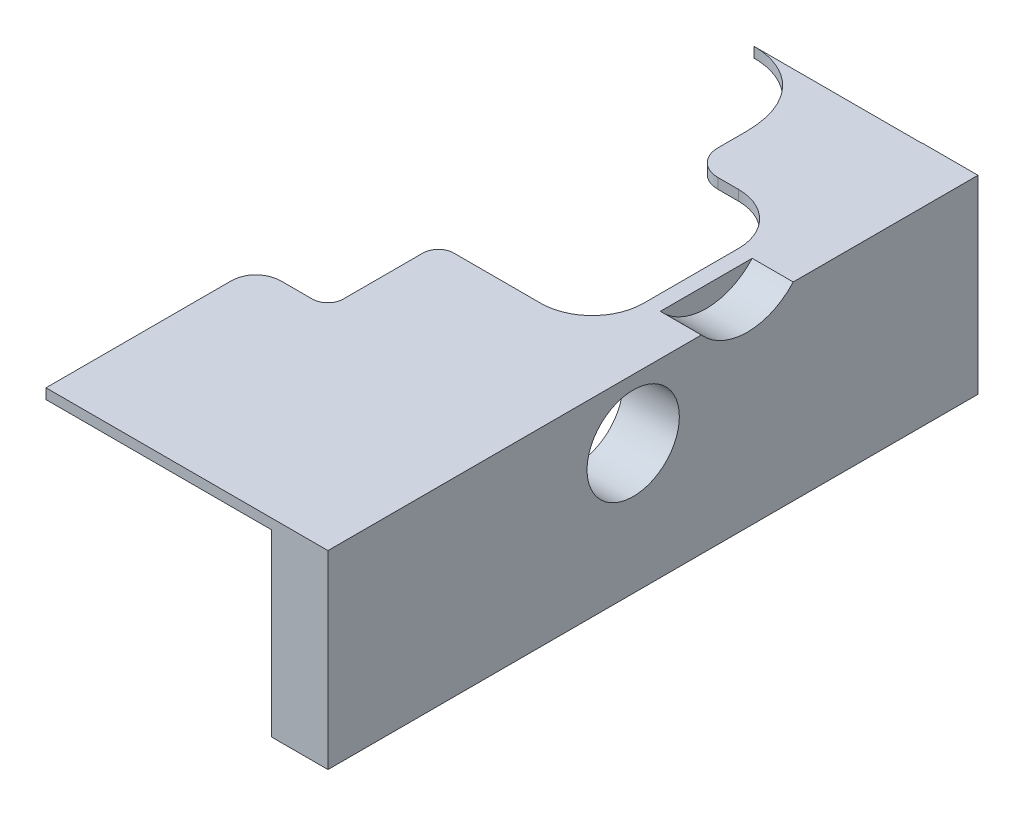
ISO-10303-21;
HEADER;
FILE_DESCRIPTION(('STEP AP214'),'2;1');
FILE_NAME('part.step','',(''),(''),'','','');
FILE_SCHEMA(('AUTOMOTIVE_DESIGN { 1 0 10303 214 1 1 1 1 }'));
ENDSEC;
DATA;
#1=APPLICATION_CONTEXT('core data for automotive mechanical design processes');
#2=APPLICATION_PROTOCOL_DEFINITION('international standard','automotive_design',2000,#1);
#3=PRODUCT_CONTEXT('',#1,'mechanical');
#4=PRODUCT('Part','Part','',(#3));
#5=PRODUCT_RELATED_PRODUCT_CATEGORY('part','',(#4));
#6=PRODUCT_DEFINITION_FORMATION('','',#4);
#7=PRODUCT_DEFINITION_CONTEXT('part definition',#1,'design');
#8=PRODUCT_DEFINITION('design','',#6,#7);
#9=PRODUCT_DEFINITION_SHAPE('','',#8);
#10=(LENGTH_UNIT() NAMED_UNIT(*) SI_UNIT(.MILLI.,.METRE.));
#11=(NAMED_UNIT(*) PLANE_ANGLE_UNIT() SI_UNIT($,.RADIAN.));
#12=(NAMED_UNIT(*) SI_UNIT($,.STERADIAN.) SOLID_ANGLE_UNIT());
#13=UNCERTAINTY_MEASURE_WITH_UNIT(LENGTH_MEASURE(1.E-05),#10,'distance_accuracy_value','');
#14=(GEOMETRIC_REPRESENTATION_CONTEXT(3) GLOBAL_UNCERTAINTY_ASSIGNED_CONTEXT((#13)) GLOBAL_UNIT_ASSIGNED_CONTEXT((#10,
#11,#12)) REPRESENTATION_CONTEXT('',''));
#15=CARTESIAN_POINT('',(0.,0.,0.));
#16=DIRECTION('',(0.,0.,1.));
#17=DIRECTION('',(1.,0.,0.));
#18=AXIS2_PLACEMENT_3D('',#15,#16,#17);
#19=CARTESIAN_POINT('',(52.5,-36.5,19.2019318721898));
#20=DIRECTION('',(0.,0.,1.));
#21=DIRECTION('',(-1.,0.,0.));
#22=AXIS2_PLACEMENT_3D('',#19,#20,#21);
#23=PLANE('',#22);
#24=DIRECTION('',(0.,1.,0.));
#25=VECTOR('',#24,1.);
#26=CARTESIAN_POINT('',(25.5,-36.5,19.2019318721898));
#27=LINE('',#26,#25);
#28=CARTESIAN_POINT('',(25.5,-28.5,19.2019318721898));
#29=VERTEX_POINT('',#28);
#30=CARTESIAN_POINT('',(25.5,-26.5,19.2019318721898));
#31=VERTEX_POINT('',#30);
#32=EDGE_CURVE('E197',#29,#31,#27,.T.);
#33=ORIENTED_EDGE('',*,*,#32,.T.);
#34=DIRECTION('',(-1.,0.,0.));
#35=VECTOR('',#34,1.);
#36=CARTESIAN_POINT('',(52.5,-26.5,19.2019318721898));
#37=LINE('',#36,#35);
#38=CARTESIAN_POINT('',(42.5,-26.5,19.2019318721898));
#39=VERTEX_POINT('',#38);
#40=EDGE_CURVE('E211',#39,#31,#37,.T.);
#41=ORIENTED_EDGE('',*,*,#40,.F.);
#42=DIRECTION('',(0.,1.,0.));
#43=VECTOR('',#42,1.);
#44=CARTESIAN_POINT('',(42.5,-26.5,19.2019318721898));
#45=LINE('',#44,#43);
#46=CARTESIAN_POINT('',(42.5,-28.5,19.2019318721898));
#47=VERTEX_POINT('',#46);
#48=EDGE_CURVE('E352',#47,#39,#45,.T.);
#49=ORIENTED_EDGE('',*,*,#48,.F.);
#50=DIRECTION('',(1.,0.,0.));
#51=VECTOR('',#50,1.);
#52=CARTESIAN_POINT('',(0.,-28.5,19.2019318721898));
#53=LINE('',#52,#51);
#54=EDGE_CURVE('E284',#29,#47,#53,.T.);
#55=ORIENTED_EDGE('',*,*,#54,.F.);
#56=EDGE_LOOP('',(#33,#41,#49,#55));
#57=FACE_BOUND('',#56,.T.);
#58=ADVANCED_FACE('F39',(#57),#23,.F.);
#59=CARTESIAN_POINT('',(8.5,-26.5,-66.7628469614296));
#60=DIRECTION('',(0.,-1.,0.));
#61=DIRECTION('',(0.,0.,-1.));
#62=AXIS2_PLACEMENT_3D('',#59,#60,#61);
#63=PLANE('',#62);
#64=CARTESIAN_POINT('',(25.5,-26.5,22.2019318721898));
#65=DIRECTION('',(0.,-1.,0.));
#66=DIRECTION('',(0.,0.,1.));
#67=AXIS2_PLACEMENT_3D('',#64,#65,#66);
#68=CIRCLE('',#67,3.);
#69=CARTESIAN_POINT('',(22.5,-26.5,22.2019318721898));
#70=VERTEX_POINT('',#69);
#71=EDGE_CURVE('E192',#70,#31,#68,.T.);
#72=ORIENTED_EDGE('',*,*,#71,.F.);
#73=DIRECTION('',(0.,0.,1.));
#74=VECTOR('',#73,1.);
#75=CARTESIAN_POINT('',(22.5,-26.5,0.));
#76=LINE('',#75,#74);
#77=CARTESIAN_POINT('',(22.5,-26.5,37.7691840241398));
#78=VERTEX_POINT('',#77);
#79=EDGE_CURVE('E200',#70,#78,#76,.T.);
#80=ORIENTED_EDGE('',*,*,#79,.T.);
#81=CARTESIAN_POINT('',(19.5,-26.5,37.7691840241398));
#82=DIRECTION('',(0.,-1.,0.));
#83=DIRECTION('',(0.,0.,1.));
#84=AXIS2_PLACEMENT_3D('',#81,#82,#83);
#85=CIRCLE('',#84,3.);
#86=CARTESIAN_POINT('',(19.5,-26.5,40.7691840241398));
#87=VERTEX_POINT('',#86);
#88=EDGE_CURVE('E206',#87,#78,#85,.F.);
#89=ORIENTED_EDGE('',*,*,#88,.F.);
#90=DIRECTION('',(1.,0.,0.));
#91=VECTOR('',#90,1.);
#92=CARTESIAN_POINT('',(0.,-26.5,40.7691840241398));
#93=LINE('',#92,#91);
#94=CARTESIAN_POINT('',(13.5,-26.5,40.7691840241398));
#95=VERTEX_POINT('',#94);
#96=EDGE_CURVE('E307',#95,#87,#93,.T.);
#97=ORIENTED_EDGE('',*,*,#96,.F.);
#98=CARTESIAN_POINT('',(13.5,-26.5,40.7691840241398));
#99=CARTESIAN_POINT('',(11.1429773960448,-26.5,40.7691840241398));
#100=CARTESIAN_POINT('',(8.49999999999999,-26.5,42.2958148022733));
#101=CARTESIAN_POINT('',(8.5,-26.5,45.7691840241398));
#102=B_SPLINE_CURVE_WITH_KNOTS('',3,(#98,#99,#100,#101),.UNSPECIFIED.,.F.,.F.,(4,4),(0.,1.),.UNSPECIFIED.);
#103=CARTESIAN_POINT('',(8.5,-26.5,45.7691840241398));
#104=VERTEX_POINT('',#103);
#105=EDGE_CURVE('E220',#95,#104,#102,.T.);
#106=ORIENTED_EDGE('',*,*,#105,.T.);
#107=DIRECTION('',(0.,0.,1.));
#108=VECTOR('',#107,1.);
#109=CARTESIAN_POINT('',(8.5,-26.5,-66.7628469614296));
#110=LINE('',#109,#108);
#111=CARTESIAN_POINT('',(8.5,-26.5,81.7371530385704));
#112=VERTEX_POINT('',#111);
#113=EDGE_CURVE('E290',#104,#112,#110,.T.);
#114=ORIENTED_EDGE('',*,*,#113,.T.);
#115=DIRECTION('',(1.,0.,0.));
#116=VECTOR('',#115,1.);
#117=CARTESIAN_POINT('',(8.5,-26.5,81.7371530385704));
#118=LINE('',#117,#116);
#119=CARTESIAN_POINT('',(63.5,-26.5,81.7371530385704));
#120=VERTEX_POINT('',#119);
#121=EDGE_CURVE('E287',#112,#120,#118,.T.);
#122=ORIENTED_EDGE('',*,*,#121,.T.);
#123=DIRECTION('',(0.,0.,1.));
#124=VECTOR('',#123,1.);
#125=CARTESIAN_POINT('',(63.5,-26.5,-66.7628469614296));
#126=LINE('',#125,#124);
#127=CARTESIAN_POINT('',(63.5,-26.5,8.90234727253723));
#128=VERTEX_POINT('',#127);
#129=EDGE_CURVE('E291',#128,#120,#126,.T.);
#130=ORIENTED_EDGE('',*,*,#129,.F.);
#131=DIRECTION('',(1.,0.,0.));
#132=VECTOR('',#131,1.);
#133=CARTESIAN_POINT('',(55.5,-26.5,8.90234727253723));
#134=LINE('',#133,#132);
#135=CARTESIAN_POINT('',(55.5,-26.5,8.90234727253723));
#136=VERTEX_POINT('',#135);
#137=EDGE_CURVE('E378',#136,#128,#134,.T.);
#138=ORIENTED_EDGE('',*,*,#137,.F.);
#139=DIRECTION('',(0.,0.,-1.));
#140=VECTOR('',#139,1.);
#141=CARTESIAN_POINT('',(55.5,-26.5,-66.7628469614296));
#142=LINE('',#141,#140);
#143=CARTESIAN_POINT('',(55.5,-26.5,-9.01082936654833));
#144=VERTEX_POINT('',#143);
#145=EDGE_CURVE('E372',#136,#144,#142,.T.);
#146=ORIENTED_EDGE('',*,*,#145,.T.);
#147=DIRECTION('',(1.,0.,0.));
#148=VECTOR('',#147,1.);
#149=CARTESIAN_POINT('',(55.5,-26.5,-9.01082936654833));
#150=LINE('',#149,#148);
#151=CARTESIAN_POINT('',(63.5,-26.5,-9.01082936654833));
#152=VERTEX_POINT('',#151);
#153=EDGE_CURVE('E375',#152,#144,#150,.F.);
#154=ORIENTED_EDGE('',*,*,#153,.F.);
#155=CARTESIAN_POINT('',(63.5,-26.5,-45.0594239487394));
#156=VERTEX_POINT('',#155);
#157=EDGE_CURVE('E294',#156,#152,#126,.T.);
#158=ORIENTED_EDGE('',*,*,#157,.F.);
#159=DIRECTION('',(-1.,0.,0.));
#160=VECTOR('',#159,1.);
#161=CARTESIAN_POINT('',(52.5,-26.5,-45.0594239487394));
#162=LINE('',#161,#160);
#163=CARTESIAN_POINT('',(52.5,-26.5,-45.0594239487394));
#164=VERTEX_POINT('',#163);
#165=EDGE_CURVE('E304',#156,#164,#162,.T.);
#166=ORIENTED_EDGE('',*,*,#165,.T.);
#167=DIRECTION('',(0.,0.,-1.));
#168=VECTOR('',#167,1.);
#169=CARTESIAN_POINT('',(52.5,-26.5,5.));
#170=LINE('',#169,#168);
#171=CARTESIAN_POINT('',(52.5,-26.5,-45.));
#172=VERTEX_POINT('',#171);
#173=EDGE_CURVE('E301',#172,#164,#170,.T.);
#174=ORIENTED_EDGE('',*,*,#173,.F.);
#175=DIRECTION('',(-1.,0.,0.));
#176=VECTOR('',#175,1.);
#177=CARTESIAN_POINT('',(57.5,-26.5,-45.));
#178=LINE('',#177,#176);
#179=CARTESIAN_POINT('',(19.8977037007898,-26.5,-45.));
#180=VERTEX_POINT('',#179);
#181=EDGE_CURVE('E300',#172,#180,#178,.T.);
#182=ORIENTED_EDGE('',*,*,#181,.T.);
#183=CARTESIAN_POINT('',(33.5,-26.5,-29.748719430866));
#184=CARTESIAN_POINT('',(33.5,-26.5,-40.0139435271604));
#185=CARTESIAN_POINT('',(26.6475341903647,-26.5,-45.));
#186=CARTESIAN_POINT('',(19.8977037007898,-26.5,-45.));
#187=B_SPLINE_CURVE_WITH_KNOTS('',3,(#183,#184,#185,#186),.UNSPECIFIED.,.F.,.F.,(4,4),(0.,1.),.UNSPECIFIED.);
#188=CARTESIAN_POINT('',(33.5,-26.5,-29.748719430866));
#189=VERTEX_POINT('',#188);
#190=EDGE_CURVE('E413',#189,#180,#187,.T.);
#191=ORIENTED_EDGE('',*,*,#190,.F.);
#192=DIRECTION('',(0.,0.,1.));
#193=VECTOR('',#192,1.);
#194=CARTESIAN_POINT('',(33.5,-26.5,0.));
#195=LINE('',#194,#193);
#196=CARTESIAN_POINT('',(33.5,-26.5,-24.3207797696685));
#197=VERTEX_POINT('',#196);
#198=EDGE_CURVE('E262',#189,#197,#195,.T.);
#199=ORIENTED_EDGE('',*,*,#198,.T.);
#200=CARTESIAN_POINT('',(38.5,-26.5,-24.3207797696685));
#201=DIRECTION('',(0.,-1.,0.));
#202=DIRECTION('',(0.,0.,1.));
#203=AXIS2_PLACEMENT_3D('',#200,#201,#202);
#204=CIRCLE('',#203,5.);
#205=CARTESIAN_POINT('',(38.5,-26.5,-19.3207797696685));
#206=VERTEX_POINT('',#205);
#207=EDGE_CURVE('E256',#206,#197,#204,.T.);
#208=ORIENTED_EDGE('',*,*,#207,.F.);
#209=DIRECTION('',(1.,0.,0.));
#210=VECTOR('',#209,1.);
#211=CARTESIAN_POINT('',(15.5,-26.5,-19.3207797696685));
#212=LINE('',#211,#210);
#213=CARTESIAN_POINT('',(42.5,-26.5,-19.3207797696685));
#214=VERTEX_POINT('',#213);
#215=EDGE_CURVE('E276',#206,#214,#212,.T.);
#216=ORIENTED_EDGE('',*,*,#215,.T.);
#217=CARTESIAN_POINT('',(42.5,-26.5,-9.32077976966851));
#218=DIRECTION('',(0.,1.,0.));
#219=DIRECTION('',(0.,0.,-1.));
#220=AXIS2_PLACEMENT_3D('',#217,#218,#219);
#221=CIRCLE('',#220,10.);
#222=CARTESIAN_POINT('',(52.5,-26.5,-9.32077976966851));
#223=VERTEX_POINT('',#222);
#224=EDGE_CURVE('E366',#223,#214,#221,.T.);
#225=ORIENTED_EDGE('',*,*,#224,.F.);
#226=CARTESIAN_POINT('',(52.5,-26.5,9.2019318721898));
#227=VERTEX_POINT('',#226);
#228=EDGE_CURVE('E297',#227,#223,#170,.T.);
#229=ORIENTED_EDGE('',*,*,#228,.F.);
#230=CARTESIAN_POINT('',(42.5,-26.5,9.2019318721898));
#231=DIRECTION('',(0.,1.,0.));
#232=DIRECTION('',(0.,0.,-1.));
#233=AXIS2_PLACEMENT_3D('',#230,#231,#232);
#234=CIRCLE('',#233,10.);
#235=EDGE_CURVE('E357',#39,#227,#234,.T.);
#236=ORIENTED_EDGE('',*,*,#235,.F.);
#237=ORIENTED_EDGE('',*,*,#40,.T.);
#238=EDGE_LOOP('',(#72,#80,#89,#97,#106,#114,#122,#130,#138,#146,#154,#158,#166,#174,#182,#191,
#199,#208,#216,#225,#229,#236,#237));
#239=FACE_BOUND('',#238,.T.);
#240=ADVANCED_FACE('F209',(#239),#63,.F.);
#241=CARTESIAN_POINT('',(0.,-28.5,0.));
#242=DIRECTION('',(0.,-1.,0.));
#243=DIRECTION('',(0.,0.,-1.));
#244=AXIS2_PLACEMENT_3D('',#241,#242,#243);
#245=PLANE('',#244);
#246=ORIENTED_EDGE('',*,*,#54,.T.);
#247=CARTESIAN_POINT('',(42.5,-28.5,9.2019318721898));
#248=DIRECTION('',(0.,1.,0.));
#249=DIRECTION('',(0.,0.,-1.));
#250=AXIS2_PLACEMENT_3D('',#247,#248,#249);
#251=CIRCLE('',#250,10.);
#252=CARTESIAN_POINT('',(52.5,-28.5,9.2019318721898));
#253=VERTEX_POINT('',#252);
#254=EDGE_CURVE('E360',#253,#47,#251,.F.);
#255=ORIENTED_EDGE('',*,*,#254,.F.);
#256=DIRECTION('',(0.,0.,-1.));
#257=VECTOR('',#256,1.);
#258=CARTESIAN_POINT('',(52.5,-28.5,0.));
#259=LINE('',#258,#257);
#260=CARTESIAN_POINT('',(52.5,-28.5,81.7371530385704));
#261=VERTEX_POINT('',#260);
#262=EDGE_CURVE('E337',#261,#253,#259,.T.);
#263=ORIENTED_EDGE('',*,*,#262,.F.);
#264=DIRECTION('',(1.,0.,0.));
#265=VECTOR('',#264,1.);
#266=CARTESIAN_POINT('',(57.5,-28.5,81.7371530385704));
#267=LINE('',#266,#265);
#268=CARTESIAN_POINT('',(8.5,-28.5,81.7371530385704));
#269=VERTEX_POINT('',#268);
#270=EDGE_CURVE('E332',#269,#261,#267,.T.);
#271=ORIENTED_EDGE('',*,*,#270,.F.);
#272=DIRECTION('',(0.,0.,-1.));
#273=VECTOR('',#272,1.);
#274=CARTESIAN_POINT('',(8.5,-28.5,0.));
#275=LINE('',#274,#273);
#276=CARTESIAN_POINT('',(8.5,-28.5,45.7691840241398));
#277=VERTEX_POINT('',#276);
#278=EDGE_CURVE('E345',#269,#277,#275,.T.);
#279=ORIENTED_EDGE('',*,*,#278,.T.);
#280=CARTESIAN_POINT('',(13.5,-28.5,40.7691840241398));
#281=CARTESIAN_POINT('',(11.1429773960448,-28.5,40.7691840241398));
#282=CARTESIAN_POINT('',(8.49999999999999,-28.5,42.2958148022733));
#283=CARTESIAN_POINT('',(8.5,-28.5,45.7691840241398));
#284=B_SPLINE_CURVE_WITH_KNOTS('',3,(#280,#281,#282,#283),.UNSPECIFIED.,.F.,.F.,(4,4),(0.,1.),.UNSPECIFIED.);
#285=CARTESIAN_POINT('',(13.5,-28.5,40.7691840241398));
#286=VERTEX_POINT('',#285);
#287=EDGE_CURVE('E207',#277,#286,#284,.F.);
#288=ORIENTED_EDGE('',*,*,#287,.T.);
#289=DIRECTION('',(1.,0.,0.));
#290=VECTOR('',#289,1.);
#291=CARTESIAN_POINT('',(0.,-28.5,40.7691840241398));
#292=LINE('',#291,#290);
#293=CARTESIAN_POINT('',(19.5,-28.5,40.7691840241398));
#294=VERTEX_POINT('',#293);
#295=EDGE_CURVE('E341',#286,#294,#292,.T.);
#296=ORIENTED_EDGE('',*,*,#295,.T.);
#297=CARTESIAN_POINT('',(19.5,-28.5,37.7691840241398));
#298=DIRECTION('',(0.,1.,0.));
#299=DIRECTION('',(0.,0.,-1.));
#300=AXIS2_PLACEMENT_3D('',#297,#298,#299);
#301=CIRCLE('',#300,3.);
#302=CARTESIAN_POINT('',(22.5,-28.5,37.7691840241398));
#303=VERTEX_POINT('',#302);
#304=EDGE_CURVE('E385',#303,#294,#301,.F.);
#305=ORIENTED_EDGE('',*,*,#304,.F.);
#306=DIRECTION('',(0.,0.,-1.));
#307=VECTOR('',#306,1.);
#308=CARTESIAN_POINT('',(22.5,-28.5,0.));
#309=LINE('',#308,#307);
#310=CARTESIAN_POINT('',(22.5,-28.5,22.2019318721898));
#311=VERTEX_POINT('',#310);
#312=EDGE_CURVE('E383',#303,#311,#309,.T.);
#313=ORIENTED_EDGE('',*,*,#312,.T.);
#314=CARTESIAN_POINT('',(25.5,-28.5,22.2019318721898));
#315=DIRECTION('',(0.,1.,0.));
#316=DIRECTION('',(0.,0.,-1.));
#317=AXIS2_PLACEMENT_3D('',#314,#315,#316);
#318=CIRCLE('',#317,3.);
#319=EDGE_CURVE('E11',#29,#311,#318,.T.);
#320=ORIENTED_EDGE('',*,*,#319,.F.);
#321=EDGE_LOOP('',(#246,#255,#263,#271,#279,#288,#296,#305,#313,#320));
#322=FACE_BOUND('',#321,.T.);
#323=ADVANCED_FACE('F393',(#322),#245,.T.);
#324=CARTESIAN_POINT('',(0.,-28.5,40.7691840241398));
#325=DIRECTION('',(0.,0.,1.));
#326=DIRECTION('',(1.,0.,0.));
#327=AXIS2_PLACEMENT_3D('',#324,#325,#326);
#328=PLANE('',#327);
#329=DIRECTION('',(0.,1.,0.));
#330=VECTOR('',#329,1.);
#331=CARTESIAN_POINT('',(13.5,-36.5,40.7691840241398));
#332=LINE('',#331,#330);
#333=EDGE_CURVE('E403',#286,#95,#332,.T.);
#334=ORIENTED_EDGE('',*,*,#333,.T.);
#335=ORIENTED_EDGE('',*,*,#96,.T.);
#336=DIRECTION('',(0.,1.,0.));
#337=VECTOR('',#336,1.);
#338=CARTESIAN_POINT('',(19.5,-36.5,40.7691840241398));
#339=LINE('',#338,#337);
#340=EDGE_CURVE('E389',#294,#87,#339,.T.);
#341=ORIENTED_EDGE('',*,*,#340,.F.);
#342=ORIENTED_EDGE('',*,*,#295,.F.);
#343=EDGE_LOOP('',(#334,#335,#341,#342));
#344=FACE_BOUND('',#343,.T.);
#345=ADVANCED_FACE('F494',(#344),#328,.F.);
#346=CARTESIAN_POINT('',(8.5,0.,0.));
#347=DIRECTION('',(-1.,0.,0.));
#348=DIRECTION('',(0.,0.,1.));
#349=AXIS2_PLACEMENT_3D('',#346,#347,#348);
#350=PLANE('',#349);
#351=ORIENTED_EDGE('',*,*,#278,.F.);
#352=DIRECTION('',(0.,1.,0.));
#353=VECTOR('',#352,1.);
#354=CARTESIAN_POINT('',(8.5,-28.5,81.7371530385704));
#355=LINE('',#354,#353);
#356=EDGE_CURVE('E335',#269,#112,#355,.T.);
#357=ORIENTED_EDGE('',*,*,#356,.T.);
#358=ORIENTED_EDGE('',*,*,#113,.F.);
#359=DIRECTION('',(0.,1.,0.));
#360=VECTOR('',#359,1.);
#361=CARTESIAN_POINT('',(8.5,-36.5,45.7691840241398));
#362=LINE('',#361,#360);
#363=EDGE_CURVE('E47',#277,#104,#362,.T.);
#364=ORIENTED_EDGE('',*,*,#363,.F.);
#365=EDGE_LOOP('',(#351,#357,#358,#364));
#366=FACE_BOUND('',#365,.T.);
#367=ADVANCED_FACE('F400',(#366),#350,.T.);
#368=DIRECTION('',(0.,0.,-1.));
#369=VECTOR('',#368,1.);
#370=CARTESIAN_POINT('',(33.5,-28.5,0.));
#371=LINE('',#370,#369);
#372=CARTESIAN_POINT('',(33.5,-28.5,-24.3207797696685));
#373=VERTEX_POINT('',#372);
#374=CARTESIAN_POINT('',(33.5,-28.5,-29.748719430866));
#375=VERTEX_POINT('',#374);
#376=EDGE_CURVE('E270',#373,#375,#371,.T.);
#377=ORIENTED_EDGE('',*,*,#376,.T.);
#378=CARTESIAN_POINT('',(33.5,-28.5,-29.748719430866));
#379=CARTESIAN_POINT('',(33.5,-28.5,-40.0139435271604));
#380=CARTESIAN_POINT('',(26.6475341903647,-28.5,-45.));
#381=CARTESIAN_POINT('',(19.8977037007898,-28.5,-45.));
#382=B_SPLINE_CURVE_WITH_KNOTS('',3,(#378,#379,#380,#381),.UNSPECIFIED.,.F.,.F.,(4,4),(0.,1.),.UNSPECIFIED.);
#383=CARTESIAN_POINT('',(19.8977037007898,-28.5,-45.));
#384=VERTEX_POINT('',#383);
#385=EDGE_CURVE('E418',#375,#384,#382,.T.);
#386=ORIENTED_EDGE('',*,*,#385,.T.);
#387=DIRECTION('',(-1.,0.,0.));
#388=VECTOR('',#387,1.);
#389=CARTESIAN_POINT('',(57.5,-28.5,-45.));
#390=LINE('',#389,#388);
#391=CARTESIAN_POINT('',(52.5,-28.5,-45.));
#392=VERTEX_POINT('',#391);
#393=EDGE_CURVE('E346',#392,#384,#390,.T.);
#394=ORIENTED_EDGE('',*,*,#393,.F.);
#395=DIRECTION('',(0.,0.,1.));
#396=VECTOR('',#395,1.);
#397=CARTESIAN_POINT('',(52.5,-28.5,0.));
#398=LINE('',#397,#396);
#399=CARTESIAN_POINT('',(52.5,-28.5,-9.32077976966851));
#400=VERTEX_POINT('',#399);
#401=EDGE_CURVE('E349',#392,#400,#398,.T.);
#402=ORIENTED_EDGE('',*,*,#401,.T.);
#403=CARTESIAN_POINT('',(42.5,-28.5,-9.32077976966851));
#404=DIRECTION('',(0.,1.,0.));
#405=DIRECTION('',(0.,0.,-1.));
#406=AXIS2_PLACEMENT_3D('',#403,#404,#405);
#407=CIRCLE('',#406,10.);
#408=CARTESIAN_POINT('',(42.5,-28.5,-19.3207797696685));
#409=VERTEX_POINT('',#408);
#410=EDGE_CURVE('E369',#409,#400,#407,.F.);
#411=ORIENTED_EDGE('',*,*,#410,.F.);
#412=DIRECTION('',(-1.,0.,0.));
#413=VECTOR('',#412,1.);
#414=CARTESIAN_POINT('',(0.,-28.5,-19.3207797696685));
#415=LINE('',#414,#413);
#416=CARTESIAN_POINT('',(38.5,-28.5,-19.3207797696685));
#417=VERTEX_POINT('',#416);
#418=EDGE_CURVE('E280',#409,#417,#415,.T.);
#419=ORIENTED_EDGE('',*,*,#418,.T.);
#420=CARTESIAN_POINT('',(38.5,-28.5,-24.3207797696685));
#421=DIRECTION('',(0.,1.,0.));
#422=DIRECTION('',(0.,0.,-1.));
#423=AXIS2_PLACEMENT_3D('',#420,#421,#422);
#424=CIRCLE('',#423,5.);
#425=EDGE_CURVE('E267',#373,#417,#424,.T.);
#426=ORIENTED_EDGE('',*,*,#425,.F.);
#427=EDGE_LOOP('',(#377,#386,#394,#402,#411,#419,#426));
#428=FACE_BOUND('',#427,.T.);
#429=ADVANCED_FACE('F445',(#428),#245,.T.);
#430=CARTESIAN_POINT('',(52.5,-23.5,-45.0594239487394));
#431=DIRECTION('',(0.,0.,-1.));
#432=DIRECTION('',(-1.,0.,0.));
#433=AXIS2_PLACEMENT_3D('',#430,#431,#432);
#434=PLANE('',#433);
#435=ORIENTED_EDGE('',*,*,#165,.F.);
#436=DIRECTION('',(0.,1.,0.));
#437=VECTOR('',#436,1.);
#438=CARTESIAN_POINT('',(63.5,-23.5,-45.0594239487394));
#439=LINE('',#438,#437);
#440=CARTESIAN_POINT('',(63.5,-63.5,-45.0594239487394));
#441=VERTEX_POINT('',#440);
#442=EDGE_CURVE('E318',#441,#156,#439,.T.);
#443=ORIENTED_EDGE('',*,*,#442,.F.);
#444=DIRECTION('',(1.,0.,0.));
#445=VECTOR('',#444,1.);
#446=CARTESIAN_POINT('',(52.5,-63.5,-45.0594239487394));
#447=LINE('',#446,#445);
#448=CARTESIAN_POINT('',(52.5,-63.5,-45.0594239487394));
#449=VERTEX_POINT('',#448);
#450=EDGE_CURVE('E313',#449,#441,#447,.T.);
#451=ORIENTED_EDGE('',*,*,#450,.F.);
#452=DIRECTION('',(0.,1.,0.));
#453=VECTOR('',#452,1.);
#454=CARTESIAN_POINT('',(52.5,-23.5,-45.0594239487394));
#455=LINE('',#454,#453);
#456=EDGE_CURVE('E324',#449,#164,#455,.T.);
#457=ORIENTED_EDGE('',*,*,#456,.T.);
#458=EDGE_LOOP('',(#435,#443,#451,#457));
#459=FACE_BOUND('',#458,.T.);
#460=ADVANCED_FACE('F480',(#459),#434,.T.);
#461=CARTESIAN_POINT('',(57.5,-23.5,-45.));
#462=DIRECTION('',(0.,0.,-1.));
#463=DIRECTION('',(-1.,0.,0.));
#464=AXIS2_PLACEMENT_3D('',#461,#462,#463);
#465=PLANE('',#464);
#466=ORIENTED_EDGE('',*,*,#181,.F.);
#467=DIRECTION('',(0.,-1.,0.));
#468=VECTOR('',#467,1.);
#469=CARTESIAN_POINT('',(52.5,-23.5,-45.));
#470=LINE('',#469,#468);
#471=EDGE_CURVE('E326',#172,#392,#470,.T.);
#472=ORIENTED_EDGE('',*,*,#471,.T.);
#473=ORIENTED_EDGE('',*,*,#393,.T.);
#474=DIRECTION('',(0.,1.,0.));
#475=VECTOR('',#474,1.);
#476=CARTESIAN_POINT('',(19.8977037007898,-48.9358514285545,-45.));
#477=LINE('',#476,#475);
#478=EDGE_CURVE('E425',#384,#180,#477,.T.);
#479=ORIENTED_EDGE('',*,*,#478,.T.);
#480=EDGE_LOOP('',(#466,#472,#473,#479));
#481=FACE_BOUND('',#480,.T.);
#482=ADVANCED_FACE('F431',(#481),#465,.T.);
#483=CARTESIAN_POINT('',(57.5,-28.5,81.7371530385704));
#484=DIRECTION('',(0.,0.,1.));
#485=DIRECTION('',(1.,0.,0.));
#486=AXIS2_PLACEMENT_3D('',#483,#484,#485);
#487=PLANE('',#486);
#488=ORIENTED_EDGE('',*,*,#121,.F.);
#489=ORIENTED_EDGE('',*,*,#356,.F.);
#490=ORIENTED_EDGE('',*,*,#270,.T.);
#491=DIRECTION('',(0.,-1.,0.));
#492=VECTOR('',#491,1.);
#493=CARTESIAN_POINT('',(52.5,-23.5,81.7371530385704));
#494=LINE('',#493,#492);
#495=CARTESIAN_POINT('',(52.5,-63.5,81.7371530385704));
#496=VERTEX_POINT('',#495);
#497=EDGE_CURVE('E321',#261,#496,#494,.T.);
#498=ORIENTED_EDGE('',*,*,#497,.T.);
#499=DIRECTION('',(1.,0.,0.));
#500=VECTOR('',#499,1.);
#501=CARTESIAN_POINT('',(52.5,-63.5,81.7371530385704));
#502=LINE('',#501,#500);
#503=CARTESIAN_POINT('',(63.5,-63.5,81.7371530385704));
#504=VERTEX_POINT('',#503);
#505=EDGE_CURVE('E315',#496,#504,#502,.T.);
#506=ORIENTED_EDGE('',*,*,#505,.T.);
#507=DIRECTION('',(0.,-1.,0.));
#508=VECTOR('',#507,1.);
#509=CARTESIAN_POINT('',(63.5,-23.5,81.7371530385704));
#510=LINE('',#509,#508);
#511=EDGE_CURVE('E329',#120,#504,#510,.T.);
#512=ORIENTED_EDGE('',*,*,#511,.F.);
#513=EDGE_LOOP('',(#488,#489,#490,#498,#506,#512));
#514=FACE_BOUND('',#513,.T.);
#515=ADVANCED_FACE('F487',(#514),#487,.T.);
#516=CARTESIAN_POINT('',(52.5,-23.5,5.));
#517=DIRECTION('',(1.,0.,0.));
#518=DIRECTION('',(0.,0.,-1.));
#519=AXIS2_PLACEMENT_3D('',#516,#517,#518);
#520=PLANE('',#519);
#521=CARTESIAN_POINT('',(52.5,-38.14,22.1971530385704));
#522=DIRECTION('',(1.,0.,0.));
#523=DIRECTION('',(0.,0.,-1.));
#524=AXIS2_PLACEMENT_3D('',#521,#522,#523);
#525=CIRCLE('',#524,9.);
#526=CARTESIAN_POINT('',(52.5,-38.14,13.1971530385705));
#527=VERTEX_POINT('',#526);
#528=EDGE_CURVE('E213',#527,#527,#525,.T.);
#529=ORIENTED_EDGE('',*,*,#528,.T.);
#530=EDGE_LOOP('',(#529));
#531=FACE_BOUND('',#530,.T.);
#532=ORIENTED_EDGE('',*,*,#401,.F.);
#533=ORIENTED_EDGE('',*,*,#471,.F.);
#534=ORIENTED_EDGE('',*,*,#173,.T.);
#535=ORIENTED_EDGE('',*,*,#456,.F.);
#536=DIRECTION('',(0.,0.,1.));
#537=VECTOR('',#536,1.);
#538=CARTESIAN_POINT('',(52.5,-63.5,81.7371530385704));
#539=LINE('',#538,#537);
#540=EDGE_CURVE('E311',#449,#496,#539,.T.);
#541=ORIENTED_EDGE('',*,*,#540,.T.);
#542=ORIENTED_EDGE('',*,*,#497,.F.);
#543=ORIENTED_EDGE('',*,*,#262,.T.);
#544=DIRECTION('',(0.,1.,0.));
#545=VECTOR('',#544,1.);
#546=CARTESIAN_POINT('',(52.5,-28.5,9.2019318721898));
#547=LINE('',#546,#545);
#548=EDGE_CURVE('E355',#227,#253,#547,.F.);
#549=ORIENTED_EDGE('',*,*,#548,.F.);
#550=ORIENTED_EDGE('',*,*,#228,.T.);
#551=DIRECTION('',(0.,1.,0.));
#552=VECTOR('',#551,1.);
#553=CARTESIAN_POINT('',(52.5,-26.5,-9.32077976966851));
#554=LINE('',#553,#552);
#555=EDGE_CURVE('E362',#400,#223,#554,.T.);
#556=ORIENTED_EDGE('',*,*,#555,.F.);
#557=EDGE_LOOP('',(#532,#533,#534,#535,#541,#542,#543,#549,#550,#556));
#558=FACE_BOUND('',#557,.T.);
#559=ADVANCED_FACE('F441',(#531,#558),#520,.F.);
#560=CARTESIAN_POINT('',(63.5,-18.5,1.38666652696873));
#561=DIRECTION('',(1.,0.,0.));
#562=DIRECTION('',(0.,0.,-1.));
#563=AXIS2_PLACEMENT_3D('',#560,#561,#562);
#564=PLANE('',#563);
#565=CARTESIAN_POINT('',(63.5,-38.14,22.1971530385704));
#566=DIRECTION('',(1.,0.,0.));
#567=DIRECTION('',(0.,0.,-1.));
#568=AXIS2_PLACEMENT_3D('',#565,#566,#567);
#569=CIRCLE('',#568,9.);
#570=CARTESIAN_POINT('',(63.5,-38.14,13.1971530385705));
#571=VERTEX_POINT('',#570);
#572=EDGE_CURVE('E216',#571,#571,#569,.T.);
#573=ORIENTED_EDGE('',*,*,#572,.F.);
#574=EDGE_LOOP('',(#573));
#575=FACE_BOUND('',#574,.T.);
#576=CARTESIAN_POINT('',(63.5,-18.51379153326,-0.0542410470055508));
#577=DIRECTION('',(-1.,0.,0.));
#578=DIRECTION('',(0.,0.,1.));
#579=AXIS2_PLACEMENT_3D('',#576,#577,#578);
#580=CIRCLE('',#579,12.);
#581=EDGE_CURVE('E273',#152,#128,#580,.T.);
#582=ORIENTED_EDGE('',*,*,#581,.T.);
#583=ORIENTED_EDGE('',*,*,#129,.T.);
#584=ORIENTED_EDGE('',*,*,#511,.T.);
#585=DIRECTION('',(0.,0.,1.));
#586=VECTOR('',#585,1.);
#587=CARTESIAN_POINT('',(63.5,-63.5,81.7371530385704));
#588=LINE('',#587,#586);
#589=EDGE_CURVE('E310',#441,#504,#588,.T.);
#590=ORIENTED_EDGE('',*,*,#589,.F.);
#591=ORIENTED_EDGE('',*,*,#442,.T.);
#592=ORIENTED_EDGE('',*,*,#157,.T.);
#593=EDGE_LOOP('',(#582,#583,#584,#590,#591,#592));
#594=FACE_BOUND('',#593,.T.);
#595=ADVANCED_FACE('F478',(#575,#594),#564,.T.);
#596=CARTESIAN_POINT('',(52.5,-63.5,81.7371530385704));
#597=DIRECTION('',(0.,1.,0.));
#598=DIRECTION('',(0.,0.,1.));
#599=AXIS2_PLACEMENT_3D('',#596,#597,#598);
#600=PLANE('',#599);
#601=ORIENTED_EDGE('',*,*,#589,.T.);
#602=ORIENTED_EDGE('',*,*,#505,.F.);
#603=ORIENTED_EDGE('',*,*,#540,.F.);
#604=ORIENTED_EDGE('',*,*,#450,.T.);
#605=EDGE_LOOP('',(#601,#602,#603,#604));
#606=FACE_BOUND('',#605,.T.);
#607=ADVANCED_FACE('F475',(#606),#600,.F.);
#608=CARTESIAN_POINT('',(42.5,-36.5,9.2019318721898));
#609=DIRECTION('',(0.,-1.,0.));
#610=DIRECTION('',(0.,0.,-1.));
#611=AXIS2_PLACEMENT_3D('',#608,#609,#610);
#612=CYLINDRICAL_SURFACE('',#611,10.);
#613=ORIENTED_EDGE('',*,*,#254,.T.);
#614=ORIENTED_EDGE('',*,*,#48,.T.);
#615=ORIENTED_EDGE('',*,*,#235,.T.);
#616=ORIENTED_EDGE('',*,*,#548,.T.);
#617=EDGE_LOOP('',(#613,#614,#615,#616));
#618=FACE_BOUND('',#617,.T.);
#619=ADVANCED_FACE('F461',(#618),#612,.F.);
#620=CARTESIAN_POINT('',(15.5,-36.5,-19.3207797696685));
#621=DIRECTION('',(0.,0.,-1.));
#622=DIRECTION('',(1.,0.,0.));
#623=AXIS2_PLACEMENT_3D('',#620,#621,#622);
#624=PLANE('',#623);
#625=ORIENTED_EDGE('',*,*,#418,.F.);
#626=DIRECTION('',(0.,1.,0.));
#627=VECTOR('',#626,1.);
#628=CARTESIAN_POINT('',(42.5,-28.5,-19.3207797696685));
#629=LINE('',#628,#627);
#630=EDGE_CURVE('E364',#214,#409,#629,.F.);
#631=ORIENTED_EDGE('',*,*,#630,.F.);
#632=ORIENTED_EDGE('',*,*,#215,.F.);
#633=DIRECTION('',(0.,1.,0.));
#634=VECTOR('',#633,1.);
#635=CARTESIAN_POINT('',(38.5,-36.5,-19.3207797696685));
#636=LINE('',#635,#634);
#637=EDGE_CURVE('E381',#417,#206,#636,.T.);
#638=ORIENTED_EDGE('',*,*,#637,.F.);
#639=EDGE_LOOP('',(#625,#631,#632,#638));
#640=FACE_BOUND('',#639,.T.);
#641=ADVANCED_FACE('F456',(#640),#624,.F.);
#642=CARTESIAN_POINT('',(42.5,-23.5,-9.32077976966851));
#643=DIRECTION('',(0.,-1.,0.));
#644=DIRECTION('',(0.,0.,-1.));
#645=AXIS2_PLACEMENT_3D('',#642,#643,#644);
#646=CYLINDRICAL_SURFACE('',#645,10.);
#647=ORIENTED_EDGE('',*,*,#410,.T.);
#648=ORIENTED_EDGE('',*,*,#555,.T.);
#649=ORIENTED_EDGE('',*,*,#224,.T.);
#650=ORIENTED_EDGE('',*,*,#630,.T.);
#651=EDGE_LOOP('',(#647,#648,#649,#650));
#652=FACE_BOUND('',#651,.T.);
#653=ADVANCED_FACE('F41',(#652),#646,.F.);
#654=CARTESIAN_POINT('',(55.5,-18.51379153326,-0.0542410470055508));
#655=DIRECTION('',(1.,0.,0.));
#656=DIRECTION('',(0.,0.,1.));
#657=AXIS2_PLACEMENT_3D('',#654,#655,#656);
#658=CYLINDRICAL_SURFACE('',#657,12.);
#659=CARTESIAN_POINT('',(55.5,-18.51379153326,-0.0542410470055508));
#660=DIRECTION('',(-1.,0.,0.));
#661=DIRECTION('',(0.,0.,1.));
#662=AXIS2_PLACEMENT_3D('',#659,#660,#661);
#663=CIRCLE('',#662,12.);
#664=EDGE_CURVE('E274',#144,#136,#663,.T.);
#665=ORIENTED_EDGE('',*,*,#664,.T.);
#666=ORIENTED_EDGE('',*,*,#137,.T.);
#667=ORIENTED_EDGE('',*,*,#581,.F.);
#668=ORIENTED_EDGE('',*,*,#153,.T.);
#669=EDGE_LOOP('',(#665,#666,#667,#668));
#670=FACE_BOUND('',#669,.T.);
#671=ADVANCED_FACE('F509',(#670),#658,.F.);
#672=CARTESIAN_POINT('',(55.5,-18.51379153326,-0.0542410470055508));
#673=DIRECTION('',(1.,0.,0.));
#674=DIRECTION('',(0.,0.,1.));
#675=AXIS2_PLACEMENT_3D('',#672,#673,#674);
#676=PLANE('',#675);
#677=ORIENTED_EDGE('',*,*,#145,.F.);
#678=ORIENTED_EDGE('',*,*,#664,.F.);
#679=EDGE_LOOP('',(#677,#678));
#680=FACE_BOUND('',#679,.T.);
#681=ADVANCED_FACE('F513',(#680),#676,.T.);
#682=CARTESIAN_POINT('',(38.5,-36.5,-24.3207797696685));
#683=DIRECTION('',(0.,1.,0.));
#684=DIRECTION('',(0.,0.,1.));
#685=AXIS2_PLACEMENT_3D('',#682,#683,#684);
#686=CYLINDRICAL_SURFACE('',#685,5.);
#687=DIRECTION('',(0.,1.,0.));
#688=VECTOR('',#687,1.);
#689=CARTESIAN_POINT('',(33.5,-36.5,-24.3207797696685));
#690=LINE('',#689,#688);
#691=EDGE_CURVE('E265',#373,#197,#690,.T.);
#692=ORIENTED_EDGE('',*,*,#691,.F.);
#693=ORIENTED_EDGE('',*,*,#425,.T.);
#694=ORIENTED_EDGE('',*,*,#637,.T.);
#695=ORIENTED_EDGE('',*,*,#207,.T.);
#696=EDGE_LOOP('',(#692,#693,#694,#695));
#697=FACE_BOUND('',#696,.T.);
#698=ADVANCED_FACE('F453',(#697),#686,.T.);
#699=CARTESIAN_POINT('',(33.5,-36.5,0.));
#700=DIRECTION('',(1.,0.,0.));
#701=DIRECTION('',(0.,0.,1.));
#702=AXIS2_PLACEMENT_3D('',#699,#700,#701);
#703=PLANE('',#702);
#704=ORIENTED_EDGE('',*,*,#376,.F.);
#705=ORIENTED_EDGE('',*,*,#691,.T.);
#706=ORIENTED_EDGE('',*,*,#198,.F.);
#707=DIRECTION('',(0.,1.,0.));
#708=VECTOR('',#707,1.);
#709=CARTESIAN_POINT('',(33.5,-48.9358514285545,-29.748719430866));
#710=LINE('',#709,#708);
#711=EDGE_CURVE('E61',#375,#189,#710,.T.);
#712=ORIENTED_EDGE('',*,*,#711,.F.);
#713=EDGE_LOOP('',(#704,#705,#706,#712));
#714=FACE_BOUND('',#713,.T.);
#715=ADVANCED_FACE('F248',(#714),#703,.F.);
#716=CARTESIAN_POINT('',(33.5,-48.9358514285545,-29.748719430866));
#717=CARTESIAN_POINT('',(33.5,-48.9358514285545,-40.0139435271604));
#718=CARTESIAN_POINT('',(26.6475341903647,-48.9358514285545,-45.));
#719=CARTESIAN_POINT('',(19.8977037007898,-48.9358514285545,-45.));
#720=B_SPLINE_CURVE_WITH_KNOTS('',3,(#716,#717,#718,#719),.UNSPECIFIED.,.F.,.F.,(4,4),(0.,1.),.UNSPECIFIED.);
#721=DIRECTION('',(0.,1.,0.));
#722=VECTOR('',#721,1.);
#723=SURFACE_OF_LINEAR_EXTRUSION('',#720,#722);
#724=ORIENTED_EDGE('',*,*,#711,.T.);
#725=ORIENTED_EDGE('',*,*,#190,.T.);
#726=ORIENTED_EDGE('',*,*,#478,.F.);
#727=ORIENTED_EDGE('',*,*,#385,.F.);
#728=EDGE_LOOP('',(#724,#725,#726,#727));
#729=FACE_BOUND('',#728,.T.);
#730=ADVANCED_FACE('F241',(#729),#723,.F.);
#731=CARTESIAN_POINT('',(19.5,-36.5,37.7691840241398));
#732=DIRECTION('',(0.,1.,0.));
#733=DIRECTION('',(0.,0.,1.));
#734=AXIS2_PLACEMENT_3D('',#731,#732,#733);
#735=CYLINDRICAL_SURFACE('',#734,3.);
#736=DIRECTION('',(0.,1.,0.));
#737=VECTOR('',#736,1.);
#738=CARTESIAN_POINT('',(22.5,-36.5,37.7691840241398));
#739=LINE('',#738,#737);
#740=EDGE_CURVE('E202',#303,#78,#739,.T.);
#741=ORIENTED_EDGE('',*,*,#740,.F.);
#742=ORIENTED_EDGE('',*,*,#304,.T.);
#743=ORIENTED_EDGE('',*,*,#340,.T.);
#744=ORIENTED_EDGE('',*,*,#88,.T.);
#745=EDGE_LOOP('',(#741,#742,#743,#744));
#746=FACE_BOUND('',#745,.T.);
#747=ADVANCED_FACE('F238',(#746),#735,.F.);
#748=CARTESIAN_POINT('',(22.5,-36.5,0.));
#749=DIRECTION('',(1.,0.,0.));
#750=DIRECTION('',(0.,0.,1.));
#751=AXIS2_PLACEMENT_3D('',#748,#749,#750);
#752=PLANE('',#751);
#753=ORIENTED_EDGE('',*,*,#312,.F.);
#754=ORIENTED_EDGE('',*,*,#740,.T.);
#755=ORIENTED_EDGE('',*,*,#79,.F.);
#756=DIRECTION('',(0.,1.,0.));
#757=VECTOR('',#756,1.);
#758=CARTESIAN_POINT('',(22.5,-36.5,22.2019318721898));
#759=LINE('',#758,#757);
#760=EDGE_CURVE('E187',#311,#70,#759,.T.);
#761=ORIENTED_EDGE('',*,*,#760,.F.);
#762=EDGE_LOOP('',(#753,#754,#755,#761));
#763=FACE_BOUND('',#762,.T.);
#764=ADVANCED_FACE('F201',(#763),#752,.F.);
#765=CARTESIAN_POINT('',(13.5,-36.5,40.7691840241398));
#766=CARTESIAN_POINT('',(11.1429773960448,-36.5,40.7691840241398));
#767=CARTESIAN_POINT('',(8.49999999999999,-36.5,42.2958148022733));
#768=CARTESIAN_POINT('',(8.5,-36.5,45.7691840241398));
#769=B_SPLINE_CURVE_WITH_KNOTS('',3,(#765,#766,#767,#768),.UNSPECIFIED.,.F.,.F.,(4,4),(0.,1.),.UNSPECIFIED.);
#770=DIRECTION('',(0.,1.,0.));
#771=VECTOR('',#770,1.);
#772=SURFACE_OF_LINEAR_EXTRUSION('',#769,#771);
#773=ORIENTED_EDGE('',*,*,#287,.F.);
#774=ORIENTED_EDGE('',*,*,#363,.T.);
#775=ORIENTED_EDGE('',*,*,#105,.F.);
#776=ORIENTED_EDGE('',*,*,#333,.F.);
#777=EDGE_LOOP('',(#773,#774,#775,#776));
#778=FACE_BOUND('',#777,.T.);
#779=ADVANCED_FACE('F233',(#778),#772,.T.);
#780=CARTESIAN_POINT('',(25.5,-36.5,22.2019318721898));
#781=DIRECTION('',(0.,1.,0.));
#782=DIRECTION('',(0.,0.,1.));
#783=AXIS2_PLACEMENT_3D('',#780,#781,#782);
#784=CYLINDRICAL_SURFACE('',#783,3.);
#785=ORIENTED_EDGE('',*,*,#32,.F.);
#786=ORIENTED_EDGE('',*,*,#319,.T.);
#787=ORIENTED_EDGE('',*,*,#760,.T.);
#788=ORIENTED_EDGE('',*,*,#71,.T.);
#789=EDGE_LOOP('',(#785,#786,#787,#788));
#790=FACE_BOUND('',#789,.T.);
#791=ADVANCED_FACE('F190',(#790),#784,.T.);
#792=CARTESIAN_POINT('',(23.5,-38.14,22.1971530385704));
#793=DIRECTION('',(1.,0.,0.));
#794=DIRECTION('',(0.,0.,-1.));
#795=AXIS2_PLACEMENT_3D('',#792,#793,#794);
#796=CYLINDRICAL_SURFACE('',#795,9.);
#797=ORIENTED_EDGE('',*,*,#572,.T.);
#798=EDGE_LOOP('',(#797));
#799=FACE_BOUND('',#798,.T.);
#800=ORIENTED_EDGE('',*,*,#528,.F.);
#801=EDGE_LOOP('',(#800));
#802=FACE_BOUND('',#801,.T.);
#803=ADVANCED_FACE('F548',(#799,#802),#796,.F.);
#804=CLOSED_SHELL('',(#58,#240,#323,#345,#367,#429,#460,#482,#515,#559,#595,#607,#619,#641,#653,
#671,#681,#698,#715,#730,#747,#764,#779,#791,#803));
#805=MANIFOLD_SOLID_BREP('B2',#804);
#806=ADVANCED_BREP_SHAPE_REPRESENTATION('',(#18,#805),#14);
#807=SHAPE_DEFINITION_REPRESENTATION(#9,#806);
ENDSEC;
END-ISO-10303-21;
